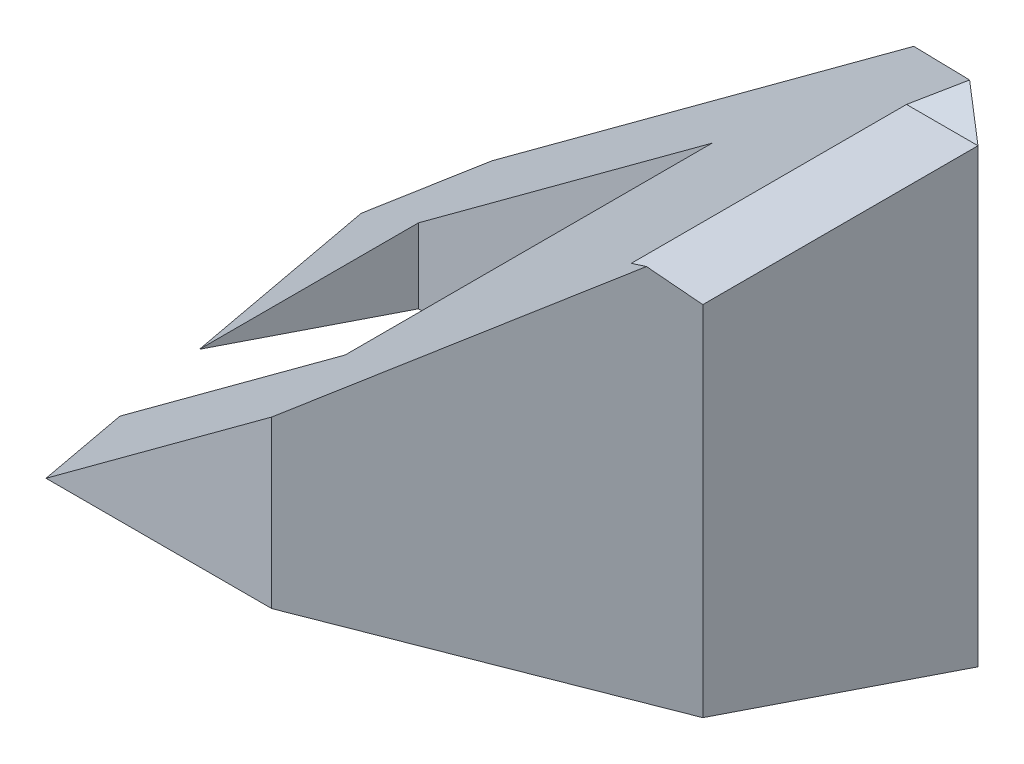
ISO-10303-21;
HEADER;
FILE_DESCRIPTION(('STEP AP214'),'2;1');
FILE_NAME('part.step','',(''),(''),'','','');
FILE_SCHEMA(('AUTOMOTIVE_DESIGN { 1 0 10303 214 1 1 1 1 }'));
ENDSEC;
DATA;
#1=APPLICATION_CONTEXT('core data for automotive mechanical design processes');
#2=APPLICATION_PROTOCOL_DEFINITION('international standard','automotive_design',2000,#1);
#3=PRODUCT_CONTEXT('',#1,'mechanical');
#4=PRODUCT('Part','Part','',(#3));
#5=PRODUCT_RELATED_PRODUCT_CATEGORY('part','',(#4));
#6=PRODUCT_DEFINITION_FORMATION('','',#4);
#7=PRODUCT_DEFINITION_CONTEXT('part definition',#1,'design');
#8=PRODUCT_DEFINITION('design','',#6,#7);
#9=PRODUCT_DEFINITION_SHAPE('','',#8);
#10=(LENGTH_UNIT() NAMED_UNIT(*) SI_UNIT(.MILLI.,.METRE.));
#11=(NAMED_UNIT(*) PLANE_ANGLE_UNIT() SI_UNIT($,.RADIAN.));
#12=(NAMED_UNIT(*) SI_UNIT($,.STERADIAN.) SOLID_ANGLE_UNIT());
#13=UNCERTAINTY_MEASURE_WITH_UNIT(LENGTH_MEASURE(1.E-05),#10,'distance_accuracy_value','');
#14=(GEOMETRIC_REPRESENTATION_CONTEXT(3) GLOBAL_UNCERTAINTY_ASSIGNED_CONTEXT((#13)) GLOBAL_UNIT_ASSIGNED_CONTEXT((#10,
#11,#12)) REPRESENTATION_CONTEXT('',''));
#15=CARTESIAN_POINT('',(0.,0.,0.));
#16=DIRECTION('',(0.,0.,1.));
#17=DIRECTION('',(1.,0.,0.));
#18=AXIS2_PLACEMENT_3D('',#15,#16,#17);
#19=CARTESIAN_POINT('',(59.3445527015057,0.,80.1151461470328));
#20=DIRECTION('',(0.595227550625738,0.,0.803557193344746));
#21=DIRECTION('',(0.803557193344746,0.,-0.595227550625738));
#22=AXIS2_PLACEMENT_3D('',#19,#20,#21);
#23=PLANE('',#22);
#24=DIRECTION('',(-0.653885296843961,0.581231376936029,0.484359479143675));
#25=VECTOR('',#24,1.);
#26=CARTESIAN_POINT('',(94.3624633970644,61.0111435829024,54.1759530392116));
#27=LINE('',#26,#25);
#28=CARTESIAN_POINT('',(100.,55.999999918919,50.));
#29=VERTEX_POINT('',#28);
#30=CARTESIAN_POINT('',(96.4714334153703,59.1365035602972,52.6137530256516));
#31=VERTEX_POINT('',#30);
#32=EDGE_CURVE('E341',#29,#31,#27,.T.);
#33=ORIENTED_EDGE('',*,*,#32,.T.);
#34=DIRECTION('',(-0.69189294809465,-0.508541316849567,0.512513294884925));
#35=VECTOR('',#34,1.);
#36=CARTESIAN_POINT('',(48.1385513667608,23.6118352545692,88.4158878764734));
#37=LINE('',#36,#35);
#38=CARTESIAN_POINT('',(73.,41.885,70.));
#39=VERTEX_POINT('',#38);
#40=EDGE_CURVE('E216',#31,#39,#37,.T.);
#41=ORIENTED_EDGE('',*,*,#40,.T.);
#42=CARTESIAN_POINT('',(73.,23.8,70.));
#43=DIRECTION('',(0.,1.,0.));
#44=VECTOR('',#43,1.);
#45=LINE('',#42,#44);
#46=CARTESIAN_POINT('',(73.,23.8,70.));
#47=VERTEX_POINT('',#46);
#48=EDGE_CURVE('E214',#47,#39,#45,.T.);
#49=ORIENTED_EDGE('',*,*,#48,.F.);
#50=DIRECTION('',(-0.787590523418659,0.198356131823959,0.583400387717525));
#51=VECTOR('',#50,1.);
#52=CARTESIAN_POINT('',(63.599945543038,26.1674211224941,76.9630033014533));
#53=LINE('',#52,#51);
#54=CARTESIAN_POINT('',(100.,17.,50.));
#55=VERTEX_POINT('',#54);
#56=EDGE_CURVE('E221',#55,#47,#53,.T.);
#57=ORIENTED_EDGE('',*,*,#56,.F.);
#58=CARTESIAN_POINT('',(100.,17.,50.));
#59=DIRECTION('',(0.,1.,0.));
#60=VECTOR('',#59,1.);
#61=LINE('',#58,#60);
#62=EDGE_CURVE('E331',#55,#29,#61,.T.);
#63=ORIENTED_EDGE('',*,*,#62,.T.);
#64=EDGE_LOOP('',(#33,#41,#49,#57,#63));
#65=FACE_BOUND('',#64,.T.);
#66=ADVANCED_FACE('F113',(#65),#23,.T.);
#67=CARTESIAN_POINT('',(25.8635961027458,0.,-34.9158547387068));
#68=DIRECTION('',(0.595227550625738,0.,-0.803557193344746));
#69=DIRECTION('',(-0.803557193344746,0.,-0.595227550625737));
#70=AXIS2_PLACEMENT_3D('',#67,#68,#69);
#71=PLANE('',#70);
#72=CARTESIAN_POINT('',(73.,0.,0.));
#73=DIRECTION('',(0.,1.,0.));
#74=VECTOR('',#73,1.);
#75=LINE('',#72,#74);
#76=CARTESIAN_POINT('',(72.9999999999999,0.,0.));
#77=VERTEX_POINT('',#76);
#78=CARTESIAN_POINT('',(73.,41.885,0.));
#79=VERTEX_POINT('',#78);
#80=EDGE_CURVE('E362',#77,#79,#75,.T.);
#81=ORIENTED_EDGE('',*,*,#80,.T.);
#82=DIRECTION('',(0.69189294809465,0.508541316849567,0.512513294884925));
#83=VECTOR('',#82,1.);
#84=CARTESIAN_POINT('',(23.3162479492665,5.36744224271087,-36.8027792968396));
#85=LINE('',#84,#83);
#86=CARTESIAN_POINT('',(96.4714334331592,59.1365035589285,17.3862470048576));
#87=VERTEX_POINT('',#86);
#88=EDGE_CURVE('E461',#79,#87,#85,.T.);
#89=ORIENTED_EDGE('',*,*,#88,.T.);
#90=DIRECTION('',(0.653885296843961,-0.581231376936029,0.484359479143675));
#91=VECTOR('',#90,1.);
#92=CARTESIAN_POINT('',(72.192375471131,80.7178884725311,-0.59824039175483));
#93=LINE('',#92,#91);
#94=CARTESIAN_POINT('',(99.9999999087839,56.,20.));
#95=VERTEX_POINT('',#94);
#96=EDGE_CURVE('E118',#87,#95,#93,.T.);
#97=ORIENTED_EDGE('',*,*,#96,.T.);
#98=CARTESIAN_POINT('',(100.,6.8,20.));
#99=DIRECTION('',(0.,1.,0.));
#100=VECTOR('',#99,1.);
#101=LINE('',#98,#100);
#102=CARTESIAN_POINT('',(100.,6.79999999999999,20.));
#103=VERTEX_POINT('',#102);
#104=EDGE_CURVE('E361',#103,#95,#101,.T.);
#105=ORIENTED_EDGE('',*,*,#104,.F.);
#106=DIRECTION('',(0.787590523418659,0.198356131823959,0.583400387717525));
#107=VECTOR('',#106,1.);
#108=CARTESIAN_POINT('',(27.7181852217419,-11.4043089071168,-33.5420850209319));
#109=LINE('',#108,#107);
#110=EDGE_CURVE('E347',#77,#103,#109,.T.);
#111=ORIENTED_EDGE('',*,*,#110,.F.);
#112=EDGE_LOOP('',(#81,#89,#97,#105,#111));
#113=FACE_BOUND('',#112,.T.);
#114=ADVANCED_FACE('F309',(#113),#71,.T.);
#115=CARTESIAN_POINT('',(9.56598759964571,0.,12.9140832595217));
#116=DIRECTION('',(-0.595227550625738,0.,-0.803557193344746));
#117=DIRECTION('',(-0.803557193344746,0.,0.595227550625738));
#118=AXIS2_PLACEMENT_3D('',#115,#116,#117);
#119=PLANE('',#118);
#120=DIRECTION('',(0.787590523418659,-0.198356131823959,-0.583400387717525));
#121=VECTOR('',#120,1.);
#122=CARTESIAN_POINT('',(10.2519315203703,4.21803206153636,12.4059766515776));
#123=LINE('',#122,#121);
#124=CARTESIAN_POINT('',(18.8174141489961,2.0607993995121,6.06117470444737));
#125=VERTEX_POINT('',#124);
#126=CARTESIAN_POINT('',(27.,0.,0.));
#127=VERTEX_POINT('',#126);
#128=EDGE_CURVE('E344',#125,#127,#123,.T.);
#129=ORIENTED_EDGE('',*,*,#128,.F.);
#130=DIRECTION('',(0.691892948094649,0.508541316849567,-0.512513294884926));
#131=VECTOR('',#130,1.);
#132=CARTESIAN_POINT('',(11.2334335873116,-3.51342631332599,11.6789380834729));
#133=LINE('',#132,#131);
#134=CARTESIAN_POINT('',(27.,8.075,0.));
#135=VERTEX_POINT('',#134);
#136=EDGE_CURVE('E456',#125,#135,#133,.T.);
#137=ORIENTED_EDGE('',*,*,#136,.T.);
#138=CARTESIAN_POINT('',(27.,0.,0.));
#139=DIRECTION('',(0.,1.,0.));
#140=VECTOR('',#139,1.);
#141=LINE('',#138,#140);
#142=EDGE_CURVE('E365',#127,#135,#141,.T.);
#143=ORIENTED_EDGE('',*,*,#142,.F.);
#144=EDGE_LOOP('',(#129,#137,#143));
#145=FACE_BOUND('',#144,.T.);
#146=ADVANCED_FACE('F303',(#145),#119,.T.);
#147=CARTESIAN_POINT('',(0.,0.,70.));
#148=DIRECTION('',(0.,0.,1.));
#149=DIRECTION('',(1.,0.,0.));
#150=AXIS2_PLACEMENT_3D('',#147,#148,#149);
#151=PLANE('',#150);
#152=ORIENTED_EDGE('',*,*,#48,.T.);
#153=DIRECTION('',(-0.805764103537805,-0.592236616100286,0.));
#154=VECTOR('',#153,1.);
#155=CARTESIAN_POINT('',(5.61667938125923,-7.64174065477446,70.));
#156=LINE('',#155,#154);
#157=CARTESIAN_POINT('',(48.3945578231292,23.8,70.));
#158=VERTEX_POINT('',#157);
#159=EDGE_CURVE('E204',#39,#158,#156,.T.);
#160=ORIENTED_EDGE('',*,*,#159,.T.);
#161=DIRECTION('',(-1.,0.,0.));
#162=VECTOR('',#161,1.);
#163=CARTESIAN_POINT('',(0.,23.8,70.));
#164=LINE('',#163,#162);
#165=EDGE_CURVE('E212',#47,#158,#164,.T.);
#166=ORIENTED_EDGE('',*,*,#165,.F.);
#167=EDGE_LOOP('',(#152,#160,#166));
#168=FACE_BOUND('',#167,.T.);
#169=ADVANCED_FACE('F211',(#168),#151,.T.);
#170=CARTESIAN_POINT('',(0.,0.,0.));
#171=DIRECTION('',(0.,0.,-1.));
#172=DIRECTION('',(-1.,0.,0.));
#173=AXIS2_PLACEMENT_3D('',#170,#171,#172);
#174=PLANE('',#173);
#175=ORIENTED_EDGE('',*,*,#142,.T.);
#176=DIRECTION('',(0.805764103537805,0.592236616100286,0.));
#177=VECTOR('',#176,1.);
#178=CARTESIAN_POINT('',(5.61667938125923,-7.64174065477446,0.));
#179=LINE('',#178,#177);
#180=EDGE_CURVE('E457',#135,#79,#179,.T.);
#181=ORIENTED_EDGE('',*,*,#180,.T.);
#182=ORIENTED_EDGE('',*,*,#80,.F.);
#183=DIRECTION('',(1.,0.,0.));
#184=VECTOR('',#183,1.);
#185=CARTESIAN_POINT('',(27.,0.,0.));
#186=LINE('',#185,#184);
#187=EDGE_CURVE('E339',#127,#77,#186,.T.);
#188=ORIENTED_EDGE('',*,*,#187,.F.);
#189=EDGE_LOOP('',(#175,#181,#182,#188));
#190=FACE_BOUND('',#189,.T.);
#191=ADVANCED_FACE('F115',(#190),#174,.T.);
#192=CARTESIAN_POINT('',(0.,32.7868852459016,39.344262295082));
#193=DIRECTION('',(0.,-0.64018439966448,-0.768221279597376));
#194=DIRECTION('',(0.,0.768221279597376,-0.64018439966448));
#195=AXIS2_PLACEMENT_3D('',#192,#193,#194);
#196=PLANE('',#195);
#197=DIRECTION('',(0.722557451514536,0.531079726863184,-0.442566439052653));
#198=VECTOR('',#197,1.);
#199=CARTESIAN_POINT('',(28.9717190768156,9.5242135214595,58.7298220654504));
#200=LINE('',#199,#198);
#201=CARTESIAN_POINT('',(92.2040816326531,56.,20.));
#202=VERTEX_POINT('',#201);
#203=EDGE_CURVE('E493',#202,#87,#200,.T.);
#204=ORIENTED_EDGE('',*,*,#203,.F.);
#205=CARTESIAN_POINT('',(92.2040816326531,56.,20.));
#206=DIRECTION('',(1.,0.,0.));
#207=VECTOR('',#206,1.);
#208=LINE('',#205,#207);
#209=EDGE_CURVE('E437',#202,#95,#208,.T.);
#210=ORIENTED_EDGE('',*,*,#209,.T.);
#211=ORIENTED_EDGE('',*,*,#96,.F.);
#212=EDGE_LOOP('',(#204,#210,#211));
#213=FACE_BOUND('',#212,.T.);
#214=ADVANCED_FACE('F405',(#213),#196,.F.);
#215=CARTESIAN_POINT('',(0.,-1.63934426229508,1.9672131147541));
#216=DIRECTION('',(0.,-0.64018439966448,0.768221279597376));
#217=DIRECTION('',(0.,-0.768221279597376,-0.64018439966448));
#218=AXIS2_PLACEMENT_3D('',#215,#216,#217);
#219=PLANE('',#218);
#220=DIRECTION('',(-0.722557451514536,-0.531079726863184,-0.442566439052653));
#221=VECTOR('',#220,1.);
#222=CARTESIAN_POINT('',(6.58714159387328,-6.92845092850314,-2.44037577375262));
#223=LINE('',#222,#221);
#224=CARTESIAN_POINT('',(92.2040816326531,56.,50.));
#225=VERTEX_POINT('',#224);
#226=EDGE_CURVE('E477',#31,#225,#223,.T.);
#227=ORIENTED_EDGE('',*,*,#226,.F.);
#228=ORIENTED_EDGE('',*,*,#32,.F.);
#229=CARTESIAN_POINT('',(92.2040816326531,56.,50.));
#230=DIRECTION('',(1.,0.,0.));
#231=VECTOR('',#230,1.);
#232=LINE('',#229,#231);
#233=EDGE_CURVE('E430',#225,#29,#232,.T.);
#234=ORIENTED_EDGE('',*,*,#233,.F.);
#235=EDGE_LOOP('',(#227,#228,#234));
#236=FACE_BOUND('',#235,.T.);
#237=ADVANCED_FACE('F410',(#236),#219,.F.);
#238=CARTESIAN_POINT('',(0.,56.,0.));
#239=DIRECTION('',(0.,-1.,0.));
#240=DIRECTION('',(0.,0.,-1.));
#241=AXIS2_PLACEMENT_3D('',#238,#239,#240);
#242=PLANE('',#241);
#243=DIRECTION('',(0.,0.,-1.));
#244=VECTOR('',#243,1.);
#245=CARTESIAN_POINT('',(92.2040816326531,56.,0.));
#246=LINE('',#245,#244);
#247=EDGE_CURVE('E476',#225,#202,#246,.T.);
#248=ORIENTED_EDGE('',*,*,#247,.F.);
#249=ORIENTED_EDGE('',*,*,#233,.T.);
#250=DIRECTION('',(0.,0.,1.));
#251=VECTOR('',#250,1.);
#252=CARTESIAN_POINT('',(100.,55.999999918919,0.));
#253=LINE('',#252,#251);
#254=EDGE_CURVE('E447',#95,#29,#253,.T.);
#255=ORIENTED_EDGE('',*,*,#254,.F.);
#256=ORIENTED_EDGE('',*,*,#209,.F.);
#257=EDGE_LOOP('',(#248,#249,#255,#256));
#258=FACE_BOUND('',#257,.T.);
#259=ADVANCED_FACE('F259',(#258),#242,.F.);
#260=CARTESIAN_POINT('',(0.,0.,15.));
#261=DIRECTION('',(0.,0.,-1.));
#262=DIRECTION('',(-1.,0.,0.));
#263=AXIS2_PLACEMENT_3D('',#260,#261,#262);
#264=PLANE('',#263);
#265=DIRECTION('',(0.805764103537805,0.592236616100286,0.));
#266=VECTOR('',#265,1.);
#267=CARTESIAN_POINT('',(5.61667938125923,-7.64174065477446,15.));
#268=LINE('',#267,#266);
#269=CARTESIAN_POINT('',(34.,13.22,15.));
#270=VERTEX_POINT('',#269);
#271=CARTESIAN_POINT('',(66.,36.74,15.));
#272=VERTEX_POINT('',#271);
#273=EDGE_CURVE('E475',#270,#272,#268,.T.);
#274=ORIENTED_EDGE('',*,*,#273,.F.);
#275=CARTESIAN_POINT('',(34.,5.09999999999999,15.));
#276=DIRECTION('',(0.,1.,0.));
#277=VECTOR('',#276,1.);
#278=LINE('',#275,#277);
#279=CARTESIAN_POINT('',(34.,5.1,15.));
#280=VERTEX_POINT('',#279);
#281=EDGE_CURVE('E222',#280,#270,#278,.T.);
#282=ORIENTED_EDGE('',*,*,#281,.F.);
#283=DIRECTION('',(1.,0.,0.));
#284=VECTOR('',#283,1.);
#285=CARTESIAN_POINT('',(0.,5.1,15.));
#286=LINE('',#285,#284);
#287=CARTESIAN_POINT('',(66.,5.1,15.));
#288=VERTEX_POINT('',#287);
#289=EDGE_CURVE('E459',#280,#288,#286,.T.);
#290=ORIENTED_EDGE('',*,*,#289,.T.);
#291=CARTESIAN_POINT('',(66.,5.09999999999999,15.));
#292=DIRECTION('',(0.,1.,0.));
#293=VECTOR('',#292,1.);
#294=LINE('',#291,#293);
#295=EDGE_CURVE('E387',#288,#272,#294,.T.);
#296=ORIENTED_EDGE('',*,*,#295,.T.);
#297=EDGE_LOOP('',(#274,#282,#290,#296));
#298=FACE_BOUND('',#297,.T.);
#299=ADVANCED_FACE('F255',(#298),#264,.F.);
#300=CARTESIAN_POINT('',(0.,0.,55.));
#301=DIRECTION('',(0.,0.,1.));
#302=DIRECTION('',(1.,0.,0.));
#303=AXIS2_PLACEMENT_3D('',#300,#301,#302);
#304=PLANE('',#303);
#305=DIRECTION('',(-0.805764103537805,-0.592236616100286,0.));
#306=VECTOR('',#305,1.);
#307=CARTESIAN_POINT('',(5.61667938125923,-7.64174065477446,55.));
#308=LINE('',#307,#306);
#309=CARTESIAN_POINT('',(66.,36.74,55.));
#310=VERTEX_POINT('',#309);
#311=CARTESIAN_POINT('',(41.4557823129252,18.7,55.));
#312=VERTEX_POINT('',#311);
#313=EDGE_CURVE('E132',#310,#312,#308,.T.);
#314=ORIENTED_EDGE('',*,*,#313,.F.);
#315=CARTESIAN_POINT('',(66.,18.7,55.));
#316=DIRECTION('',(0.,1.,0.));
#317=VECTOR('',#316,1.);
#318=LINE('',#315,#317);
#319=CARTESIAN_POINT('',(66.,18.7,55.));
#320=VERTEX_POINT('',#319);
#321=EDGE_CURVE('E225',#320,#310,#318,.T.);
#322=ORIENTED_EDGE('',*,*,#321,.F.);
#323=DIRECTION('',(-1.,0.,0.));
#324=VECTOR('',#323,1.);
#325=CARTESIAN_POINT('',(0.,18.7,55.));
#326=LINE('',#325,#324);
#327=EDGE_CURVE('E139',#320,#312,#326,.T.);
#328=ORIENTED_EDGE('',*,*,#327,.T.);
#329=EDGE_LOOP('',(#314,#322,#328));
#330=FACE_BOUND('',#329,.T.);
#331=ADVANCED_FACE('F252',(#330),#304,.F.);
#332=CARTESIAN_POINT('',(34.,0.,0.));
#333=DIRECTION('',(-1.,0.,0.));
#334=DIRECTION('',(0.,0.,1.));
#335=AXIS2_PLACEMENT_3D('',#332,#333,#334);
#336=PLANE('',#335);
#337=DIRECTION('',(0.,0.,-1.));
#338=VECTOR('',#337,1.);
#339=CARTESIAN_POINT('',(34.,13.22,0.));
#340=LINE('',#339,#338);
#341=CARTESIAN_POINT('',(34.,13.22,38.8823529411765));
#342=VERTEX_POINT('',#341);
#343=EDGE_CURVE('E474',#342,#270,#340,.T.);
#344=ORIENTED_EDGE('',*,*,#343,.F.);
#345=DIRECTION('',(0.,-0.321902733238702,-0.946772744819713));
#346=VECTOR('',#345,1.);
#347=CARTESIAN_POINT('',(34.,0.,0.));
#348=LINE('',#347,#346);
#349=EDGE_CURVE('E348',#342,#280,#348,.T.);
#350=ORIENTED_EDGE('',*,*,#349,.T.);
#351=ORIENTED_EDGE('',*,*,#281,.T.);
#352=EDGE_LOOP('',(#344,#350,#351));
#353=FACE_BOUND('',#352,.T.);
#354=ADVANCED_FACE('F242',(#353),#336,.F.);
#355=CARTESIAN_POINT('',(66.,0.,0.));
#356=DIRECTION('',(1.,0.,0.));
#357=DIRECTION('',(0.,0.,-1.));
#358=AXIS2_PLACEMENT_3D('',#355,#356,#357);
#359=PLANE('',#358);
#360=DIRECTION('',(0.,0.,1.));
#361=VECTOR('',#360,1.);
#362=CARTESIAN_POINT('',(66.,36.74,0.));
#363=LINE('',#362,#361);
#364=EDGE_CURVE('E479',#272,#310,#363,.T.);
#365=ORIENTED_EDGE('',*,*,#364,.F.);
#366=ORIENTED_EDGE('',*,*,#295,.F.);
#367=DIRECTION('',(0.,0.321902733238702,0.946772744819713));
#368=VECTOR('',#367,1.);
#369=CARTESIAN_POINT('',(66.,0.,0.));
#370=LINE('',#369,#368);
#371=EDGE_CURVE('E207',#288,#320,#370,.T.);
#372=ORIENTED_EDGE('',*,*,#371,.T.);
#373=ORIENTED_EDGE('',*,*,#321,.T.);
#374=EDGE_LOOP('',(#365,#366,#372,#373));
#375=FACE_BOUND('',#374,.T.);
#376=ADVANCED_FACE('F251',(#375),#359,.F.);
#377=CARTESIAN_POINT('',(0.,0.,0.));
#378=DIRECTION('',(0.,0.946772744819713,-0.321902733238702));
#379=DIRECTION('',(0.,0.321902733238702,0.946772744819713));
#380=AXIS2_PLACEMENT_3D('',#377,#378,#379);
#381=PLANE('',#380);
#382=DIRECTION('',(0.401174701933839,0.294863405921372,0.867245311533446));
#383=VECTOR('',#382,1.);
#384=CARTESIAN_POINT('',(13.4363575032354,-1.89427723512197,-5.57140363271165));
#385=LINE('',#384,#383);
#386=EDGE_CURVE('E12',#125,#342,#385,.T.);
#387=ORIENTED_EDGE('',*,*,#386,.F.);
#388=ORIENTED_EDGE('',*,*,#128,.T.);
#389=ORIENTED_EDGE('',*,*,#187,.T.);
#390=ORIENTED_EDGE('',*,*,#110,.T.);
#391=DIRECTION('',(0.,0.321902733238702,0.946772744819713));
#392=VECTOR('',#391,1.);
#393=CARTESIAN_POINT('',(100.,0.,0.));
#394=LINE('',#393,#392);
#395=EDGE_CURVE('E226',#103,#55,#394,.T.);
#396=ORIENTED_EDGE('',*,*,#395,.T.);
#397=ORIENTED_EDGE('',*,*,#56,.T.);
#398=ORIENTED_EDGE('',*,*,#165,.T.);
#399=EDGE_CURVE('E124',#312,#158,#385,.T.);
#400=ORIENTED_EDGE('',*,*,#399,.F.);
#401=ORIENTED_EDGE('',*,*,#327,.F.);
#402=ORIENTED_EDGE('',*,*,#371,.F.);
#403=ORIENTED_EDGE('',*,*,#289,.F.);
#404=ORIENTED_EDGE('',*,*,#349,.F.);
#405=EDGE_LOOP('',(#387,#388,#389,#390,#396,#397,#398,#400,#401,#402,#403,#404));
#406=FACE_BOUND('',#405,.T.);
#407=ADVANCED_FACE('F219',(#406),#381,.F.);
#408=CARTESIAN_POINT('',(100.,0.,0.));
#409=DIRECTION('',(1.,0.,0.));
#410=DIRECTION('',(0.,0.,-1.));
#411=AXIS2_PLACEMENT_3D('',#408,#409,#410);
#412=PLANE('',#411);
#413=ORIENTED_EDGE('',*,*,#395,.F.);
#414=ORIENTED_EDGE('',*,*,#104,.T.);
#415=ORIENTED_EDGE('',*,*,#254,.T.);
#416=ORIENTED_EDGE('',*,*,#62,.F.);
#417=EDGE_LOOP('',(#413,#414,#415,#416));
#418=FACE_BOUND('',#417,.T.);
#419=ADVANCED_FACE('F311',(#418),#412,.T.);
#420=CARTESIAN_POINT('',(5.61667938125923,-7.64174065477447,0.));
#421=DIRECTION('',(-0.592236616100286,0.805764103537805,0.));
#422=DIRECTION('',(-0.805764103537805,-0.592236616100286,0.));
#423=AXIS2_PLACEMENT_3D('',#420,#421,#422);
#424=PLANE('',#423);
#425=ORIENTED_EDGE('',*,*,#386,.T.);
#426=ORIENTED_EDGE('',*,*,#343,.T.);
#427=ORIENTED_EDGE('',*,*,#273,.T.);
#428=ORIENTED_EDGE('',*,*,#364,.T.);
#429=ORIENTED_EDGE('',*,*,#313,.T.);
#430=ORIENTED_EDGE('',*,*,#399,.T.);
#431=ORIENTED_EDGE('',*,*,#159,.F.);
#432=ORIENTED_EDGE('',*,*,#40,.F.);
#433=ORIENTED_EDGE('',*,*,#226,.T.);
#434=ORIENTED_EDGE('',*,*,#247,.T.);
#435=ORIENTED_EDGE('',*,*,#203,.T.);
#436=ORIENTED_EDGE('',*,*,#88,.F.);
#437=ORIENTED_EDGE('',*,*,#180,.F.);
#438=ORIENTED_EDGE('',*,*,#136,.F.);
#439=EDGE_LOOP('',(#425,#426,#427,#428,#429,#430,#431,#432,#433,#434,#435,#436,#437,#438));
#440=FACE_BOUND('',#439,.T.);
#441=ADVANCED_FACE('F203',(#440),#424,.T.);
#442=CLOSED_SHELL('',(#66,#114,#146,#169,#191,#214,#237,#259,#299,#331,#354,#376,#407,#419,#441));
#443=MANIFOLD_SOLID_BREP('B2',#442);
#444=ADVANCED_BREP_SHAPE_REPRESENTATION('',(#18,#443),#14);
#445=SHAPE_DEFINITION_REPRESENTATION(#9,#444);
ENDSEC;
END-ISO-10303-21;
